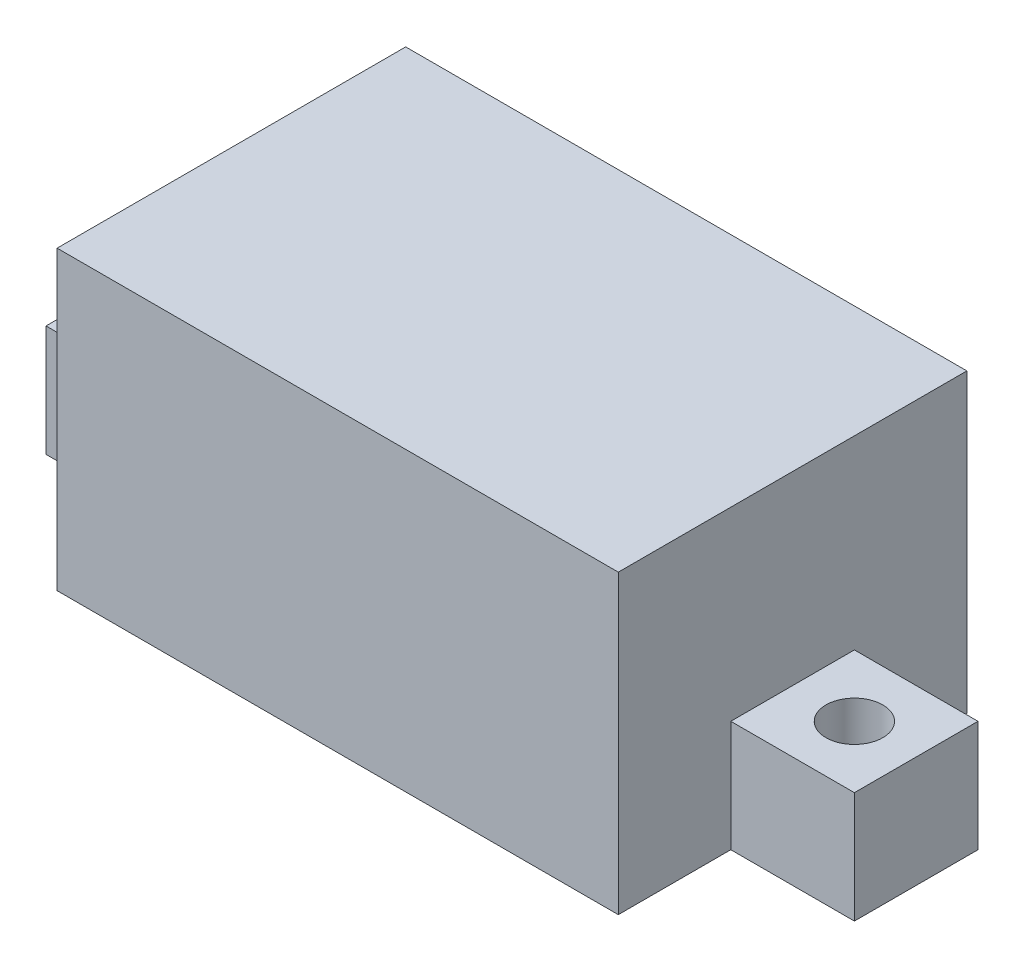
ISO-10303-21;
HEADER;
FILE_DESCRIPTION(('STEP AP214'),'2;1');
FILE_NAME('part.step','',(''),(''),'','','');
FILE_SCHEMA(('AUTOMOTIVE_DESIGN { 1 0 10303 214 1 1 1 1 }'));
ENDSEC;
DATA;
#1=APPLICATION_CONTEXT('core data for automotive mechanical design processes');
#2=APPLICATION_PROTOCOL_DEFINITION('international standard','automotive_design',2000,#1);
#3=PRODUCT_CONTEXT('',#1,'mechanical');
#4=PRODUCT('Part','Part','',(#3));
#5=PRODUCT_RELATED_PRODUCT_CATEGORY('part','',(#4));
#6=PRODUCT_DEFINITION_FORMATION('','',#4);
#7=PRODUCT_DEFINITION_CONTEXT('part definition',#1,'design');
#8=PRODUCT_DEFINITION('design','',#6,#7);
#9=PRODUCT_DEFINITION_SHAPE('','',#8);
#10=(LENGTH_UNIT() NAMED_UNIT(*) SI_UNIT(.MILLI.,.METRE.));
#11=(NAMED_UNIT(*) PLANE_ANGLE_UNIT() SI_UNIT($,.RADIAN.));
#12=(NAMED_UNIT(*) SI_UNIT($,.STERADIAN.) SOLID_ANGLE_UNIT());
#13=UNCERTAINTY_MEASURE_WITH_UNIT(LENGTH_MEASURE(1.E-05),#10,'distance_accuracy_value','');
#14=(GEOMETRIC_REPRESENTATION_CONTEXT(3) GLOBAL_UNCERTAINTY_ASSIGNED_CONTEXT((#13)) GLOBAL_UNIT_ASSIGNED_CONTEXT((#10,
#11,#12)) REPRESENTATION_CONTEXT('',''));
#15=CARTESIAN_POINT('',(0.,0.,0.));
#16=DIRECTION('',(0.,0.,1.));
#17=DIRECTION('',(1.,0.,0.));
#18=AXIS2_PLACEMENT_3D('',#15,#16,#17);
#19=CARTESIAN_POINT('',(22.7,12.,0.));
#20=DIRECTION('',(-1.,0.,0.));
#21=DIRECTION('',(0.,0.,1.));
#22=AXIS2_PLACEMENT_3D('',#19,#20,#21);
#23=PLANE('',#22);
#24=DIRECTION('',(0.,-1.,0.));
#25=VECTOR('',#24,1.);
#26=CARTESIAN_POINT('',(22.7,4.5,-4.55));
#27=LINE('',#26,#25);
#28=CARTESIAN_POINT('',(22.7,4.5,-4.55));
#29=VERTEX_POINT('',#28);
#30=CARTESIAN_POINT('',(22.7,0.,-4.55));
#31=VERTEX_POINT('',#30);
#32=EDGE_CURVE('E146',#29,#31,#27,.T.);
#33=ORIENTED_EDGE('',*,*,#32,.F.);
#34=DIRECTION('',(0.,0.,-1.));
#35=VECTOR('',#34,1.);
#36=CARTESIAN_POINT('',(22.7,4.5,-4.55));
#37=LINE('',#36,#35);
#38=CARTESIAN_POINT('',(22.7,4.5,-9.55));
#39=VERTEX_POINT('',#38);
#40=EDGE_CURVE('E131',#29,#39,#37,.T.);
#41=ORIENTED_EDGE('',*,*,#40,.T.);
#42=DIRECTION('',(0.,-1.,0.));
#43=VECTOR('',#42,1.);
#44=CARTESIAN_POINT('',(22.7,4.5,-9.55));
#45=LINE('',#44,#43);
#46=CARTESIAN_POINT('',(22.7,0.,-9.55));
#47=VERTEX_POINT('',#46);
#48=EDGE_CURVE('E155',#39,#47,#45,.T.);
#49=ORIENTED_EDGE('',*,*,#48,.T.);
#50=DIRECTION('',(0.,0.,-1.));
#51=VECTOR('',#50,1.);
#52=CARTESIAN_POINT('',(22.7,0.,0.));
#53=LINE('',#52,#51);
#54=CARTESIAN_POINT('',(22.7,0.,-14.1));
#55=VERTEX_POINT('',#54);
#56=EDGE_CURVE('E232',#47,#55,#53,.T.);
#57=ORIENTED_EDGE('',*,*,#56,.T.);
#58=DIRECTION('',(0.,-1.,0.));
#59=VECTOR('',#58,1.);
#60=CARTESIAN_POINT('',(22.7,12.,-14.1));
#61=LINE('',#60,#59);
#62=CARTESIAN_POINT('',(22.7,12.,-14.1));
#63=VERTEX_POINT('',#62);
#64=EDGE_CURVE('E49',#63,#55,#61,.T.);
#65=ORIENTED_EDGE('',*,*,#64,.F.);
#66=DIRECTION('',(0.,0.,-1.));
#67=VECTOR('',#66,1.);
#68=CARTESIAN_POINT('',(22.7,12.,0.));
#69=LINE('',#68,#67);
#70=CARTESIAN_POINT('',(22.7,12.,0.));
#71=VERTEX_POINT('',#70);
#72=EDGE_CURVE('E216',#71,#63,#69,.T.);
#73=ORIENTED_EDGE('',*,*,#72,.F.);
#74=DIRECTION('',(0.,-1.,0.));
#75=VECTOR('',#74,1.);
#76=CARTESIAN_POINT('',(22.7,12.,0.));
#77=LINE('',#76,#75);
#78=CARTESIAN_POINT('',(22.7,0.,0.));
#79=VERTEX_POINT('',#78);
#80=EDGE_CURVE('E11',#71,#79,#77,.T.);
#81=ORIENTED_EDGE('',*,*,#80,.T.);
#82=EDGE_CURVE('E153',#79,#31,#53,.T.);
#83=ORIENTED_EDGE('',*,*,#82,.T.);
#84=EDGE_LOOP('',(#33,#41,#49,#57,#65,#73,#81,#83));
#85=FACE_BOUND('',#84,.T.);
#86=ADVANCED_FACE('F40',(#85),#23,.F.);
#87=CARTESIAN_POINT('',(0.,12.,0.));
#88=DIRECTION('',(0.,0.,-1.));
#89=DIRECTION('',(-1.,0.,0.));
#90=AXIS2_PLACEMENT_3D('',#87,#88,#89);
#91=PLANE('',#90);
#92=DIRECTION('',(1.,0.,0.));
#93=VECTOR('',#92,1.);
#94=CARTESIAN_POINT('',(0.,0.,0.));
#95=LINE('',#94,#93);
#96=CARTESIAN_POINT('',(0.,0.,0.));
#97=VERTEX_POINT('',#96);
#98=EDGE_CURVE('E203',#97,#79,#95,.T.);
#99=ORIENTED_EDGE('',*,*,#98,.T.);
#100=ORIENTED_EDGE('',*,*,#80,.F.);
#101=DIRECTION('',(1.,0.,0.));
#102=VECTOR('',#101,1.);
#103=CARTESIAN_POINT('',(0.,12.,0.));
#104=LINE('',#103,#102);
#105=CARTESIAN_POINT('',(0.,12.,0.));
#106=VERTEX_POINT('',#105);
#107=EDGE_CURVE('E212',#106,#71,#104,.T.);
#108=ORIENTED_EDGE('',*,*,#107,.F.);
#109=DIRECTION('',(0.,-1.,0.));
#110=VECTOR('',#109,1.);
#111=CARTESIAN_POINT('',(0.,12.,0.));
#112=LINE('',#111,#110);
#113=EDGE_CURVE('E228',#106,#97,#112,.T.);
#114=ORIENTED_EDGE('',*,*,#113,.T.);
#115=EDGE_LOOP('',(#99,#100,#108,#114));
#116=FACE_BOUND('',#115,.T.);
#117=ADVANCED_FACE('F42',(#116),#91,.F.);
#118=CARTESIAN_POINT('',(0.,12.,-14.1));
#119=DIRECTION('',(0.,0.,-1.));
#120=DIRECTION('',(-1.,0.,0.));
#121=AXIS2_PLACEMENT_3D('',#118,#119,#120);
#122=PLANE('',#121);
#123=DIRECTION('',(1.,0.,0.));
#124=VECTOR('',#123,1.);
#125=CARTESIAN_POINT('',(0.,0.,-14.1));
#126=LINE('',#125,#124);
#127=CARTESIAN_POINT('',(0.,0.,-14.1));
#128=VERTEX_POINT('',#127);
#129=EDGE_CURVE('E235',#128,#55,#126,.T.);
#130=ORIENTED_EDGE('',*,*,#129,.F.);
#131=DIRECTION('',(0.,-1.,0.));
#132=VECTOR('',#131,1.);
#133=CARTESIAN_POINT('',(0.,12.,-14.1));
#134=LINE('',#133,#132);
#135=CARTESIAN_POINT('',(0.,12.,-14.1));
#136=VERTEX_POINT('',#135);
#137=EDGE_CURVE('E245',#136,#128,#134,.T.);
#138=ORIENTED_EDGE('',*,*,#137,.F.);
#139=DIRECTION('',(1.,0.,0.));
#140=VECTOR('',#139,1.);
#141=CARTESIAN_POINT('',(0.,12.,-14.1));
#142=LINE('',#141,#140);
#143=EDGE_CURVE('E220',#136,#63,#142,.T.);
#144=ORIENTED_EDGE('',*,*,#143,.T.);
#145=ORIENTED_EDGE('',*,*,#64,.T.);
#146=EDGE_LOOP('',(#130,#138,#144,#145));
#147=FACE_BOUND('',#146,.T.);
#148=ADVANCED_FACE('F254',(#147),#122,.T.);
#149=CARTESIAN_POINT('',(0.,12.,0.));
#150=DIRECTION('',(-1.,0.,0.));
#151=DIRECTION('',(0.,0.,1.));
#152=AXIS2_PLACEMENT_3D('',#149,#150,#151);
#153=PLANE('',#152);
#154=DIRECTION('',(0.,-1.,0.));
#155=VECTOR('',#154,1.);
#156=CARTESIAN_POINT('',(0.,4.5,-9.55));
#157=LINE('',#156,#155);
#158=CARTESIAN_POINT('',(0.,4.5,-9.55));
#159=VERTEX_POINT('',#158);
#160=CARTESIAN_POINT('',(0.,0.,-9.55));
#161=VERTEX_POINT('',#160);
#162=EDGE_CURVE('E200',#159,#161,#157,.T.);
#163=ORIENTED_EDGE('',*,*,#162,.F.);
#164=DIRECTION('',(0.,0.,1.));
#165=VECTOR('',#164,1.);
#166=CARTESIAN_POINT('',(0.,4.5,-4.55));
#167=LINE('',#166,#165);
#168=CARTESIAN_POINT('',(0.,4.5,-4.55));
#169=VERTEX_POINT('',#168);
#170=EDGE_CURVE('E175',#159,#169,#167,.T.);
#171=ORIENTED_EDGE('',*,*,#170,.T.);
#172=DIRECTION('',(0.,-1.,0.));
#173=VECTOR('',#172,1.);
#174=CARTESIAN_POINT('',(0.,4.5,-4.55));
#175=LINE('',#174,#173);
#176=CARTESIAN_POINT('',(0.,0.,-4.55));
#177=VERTEX_POINT('',#176);
#178=EDGE_CURVE('E191',#169,#177,#175,.T.);
#179=ORIENTED_EDGE('',*,*,#178,.T.);
#180=DIRECTION('',(0.,0.,-1.));
#181=VECTOR('',#180,1.);
#182=CARTESIAN_POINT('',(0.,0.,0.));
#183=LINE('',#182,#181);
#184=EDGE_CURVE('E217',#97,#177,#183,.T.);
#185=ORIENTED_EDGE('',*,*,#184,.F.);
#186=ORIENTED_EDGE('',*,*,#113,.F.);
#187=DIRECTION('',(0.,0.,-1.));
#188=VECTOR('',#187,1.);
#189=CARTESIAN_POINT('',(0.,12.,0.));
#190=LINE('',#189,#188);
#191=EDGE_CURVE('E224',#106,#136,#190,.T.);
#192=ORIENTED_EDGE('',*,*,#191,.T.);
#193=ORIENTED_EDGE('',*,*,#137,.T.);
#194=EDGE_CURVE('E239',#161,#128,#183,.T.);
#195=ORIENTED_EDGE('',*,*,#194,.F.);
#196=EDGE_LOOP('',(#163,#171,#179,#185,#186,#192,#193,#195));
#197=FACE_BOUND('',#196,.T.);
#198=ADVANCED_FACE('F266',(#197),#153,.T.);
#199=CARTESIAN_POINT('',(0.,12.,0.));
#200=DIRECTION('',(0.,1.,0.));
#201=DIRECTION('',(0.,0.,1.));
#202=AXIS2_PLACEMENT_3D('',#199,#200,#201);
#203=PLANE('',#202);
#204=ORIENTED_EDGE('',*,*,#107,.T.);
#205=ORIENTED_EDGE('',*,*,#72,.T.);
#206=ORIENTED_EDGE('',*,*,#143,.F.);
#207=ORIENTED_EDGE('',*,*,#191,.F.);
#208=EDGE_LOOP('',(#204,#205,#206,#207));
#209=FACE_BOUND('',#208,.T.);
#210=ADVANCED_FACE('F269',(#209),#203,.T.);
#211=CARTESIAN_POINT('',(0.,0.,0.));
#212=DIRECTION('',(0.,1.,0.));
#213=DIRECTION('',(0.,0.,1.));
#214=AXIS2_PLACEMENT_3D('',#211,#212,#213);
#215=PLANE('',#214);
#216=ORIENTED_EDGE('',*,*,#98,.F.);
#217=ORIENTED_EDGE('',*,*,#184,.T.);
#218=DIRECTION('',(-1.,0.,0.));
#219=VECTOR('',#218,1.);
#220=CARTESIAN_POINT('',(0.,0.,-4.55));
#221=LINE('',#220,#219);
#222=CARTESIAN_POINT('',(-5.,0.,-4.55));
#223=VERTEX_POINT('',#222);
#224=EDGE_CURVE('E64',#177,#223,#221,.T.);
#225=ORIENTED_EDGE('',*,*,#224,.T.);
#226=DIRECTION('',(0.,0.,-1.));
#227=VECTOR('',#226,1.);
#228=CARTESIAN_POINT('',(-5.,0.,-4.55));
#229=LINE('',#228,#227);
#230=CARTESIAN_POINT('',(-5.,0.,-9.55));
#231=VERTEX_POINT('',#230);
#232=EDGE_CURVE('E194',#223,#231,#229,.T.);
#233=ORIENTED_EDGE('',*,*,#232,.T.);
#234=DIRECTION('',(1.,0.,0.));
#235=VECTOR('',#234,1.);
#236=CARTESIAN_POINT('',(0.,0.,-9.55));
#237=LINE('',#236,#235);
#238=EDGE_CURVE('E180',#231,#161,#237,.T.);
#239=ORIENTED_EDGE('',*,*,#238,.T.);
#240=ORIENTED_EDGE('',*,*,#194,.T.);
#241=ORIENTED_EDGE('',*,*,#129,.T.);
#242=ORIENTED_EDGE('',*,*,#56,.F.);
#243=DIRECTION('',(1.,0.,0.));
#244=VECTOR('',#243,1.);
#245=CARTESIAN_POINT('',(22.7,0.,-9.55));
#246=LINE('',#245,#244);
#247=CARTESIAN_POINT('',(27.7,0.,-9.55));
#248=VERTEX_POINT('',#247);
#249=EDGE_CURVE('E56',#47,#248,#246,.T.);
#250=ORIENTED_EDGE('',*,*,#249,.T.);
#251=DIRECTION('',(0.,0.,1.));
#252=VECTOR('',#251,1.);
#253=CARTESIAN_POINT('',(27.7,0.,-4.55));
#254=LINE('',#253,#252);
#255=CARTESIAN_POINT('',(27.7,0.,-4.55));
#256=VERTEX_POINT('',#255);
#257=EDGE_CURVE('E150',#248,#256,#254,.T.);
#258=ORIENTED_EDGE('',*,*,#257,.T.);
#259=DIRECTION('',(-1.,0.,0.));
#260=VECTOR('',#259,1.);
#261=CARTESIAN_POINT('',(22.7,0.,-4.55));
#262=LINE('',#261,#260);
#263=EDGE_CURVE('E345',#256,#31,#262,.T.);
#264=ORIENTED_EDGE('',*,*,#263,.T.);
#265=ORIENTED_EDGE('',*,*,#82,.F.);
#266=EDGE_LOOP('',(#216,#217,#225,#233,#239,#240,#241,#242,#250,#258,#264,#265));
#267=FACE_BOUND('',#266,.T.);
#268=CARTESIAN_POINT('',(-2.5,0.,-7.05));
#269=DIRECTION('',(0.,-1.,0.));
#270=DIRECTION('',(0.,0.,-1.));
#271=AXIS2_PLACEMENT_3D('',#268,#269,#270);
#272=CIRCLE('',#271,1.15);
#273=CARTESIAN_POINT('',(-2.5,0.,-8.2));
#274=VERTEX_POINT('',#273);
#275=EDGE_CURVE('E171',#274,#274,#272,.T.);
#276=ORIENTED_EDGE('',*,*,#275,.F.);
#277=EDGE_LOOP('',(#276));
#278=FACE_BOUND('',#277,.T.);
#279=CARTESIAN_POINT('',(25.2,0.,-7.05));
#280=DIRECTION('',(0.,-1.,0.));
#281=DIRECTION('',(0.,0.,1.));
#282=AXIS2_PLACEMENT_3D('',#279,#280,#281);
#283=CIRCLE('',#282,1.15);
#284=CARTESIAN_POINT('',(25.2,0.,-5.9));
#285=VERTEX_POINT('',#284);
#286=EDGE_CURVE('E340',#285,#285,#283,.T.);
#287=ORIENTED_EDGE('',*,*,#286,.F.);
#288=EDGE_LOOP('',(#287));
#289=FACE_BOUND('',#288,.T.);
#290=ADVANCED_FACE('F259',(#267,#278,#289),#215,.F.);
#291=CARTESIAN_POINT('',(0.,4.5,-9.55));
#292=DIRECTION('',(0.,0.,-1.));
#293=DIRECTION('',(-1.,0.,0.));
#294=AXIS2_PLACEMENT_3D('',#291,#292,#293);
#295=PLANE('',#294);
#296=ORIENTED_EDGE('',*,*,#238,.F.);
#297=DIRECTION('',(0.,-1.,0.));
#298=VECTOR('',#297,1.);
#299=CARTESIAN_POINT('',(-5.,4.5,-9.55));
#300=LINE('',#299,#298);
#301=CARTESIAN_POINT('',(-5.,4.5,-9.55));
#302=VERTEX_POINT('',#301);
#303=EDGE_CURVE('E204',#302,#231,#300,.T.);
#304=ORIENTED_EDGE('',*,*,#303,.F.);
#305=DIRECTION('',(1.,0.,0.));
#306=VECTOR('',#305,1.);
#307=CARTESIAN_POINT('',(0.,4.5,-9.55));
#308=LINE('',#307,#306);
#309=EDGE_CURVE('E187',#302,#159,#308,.T.);
#310=ORIENTED_EDGE('',*,*,#309,.T.);
#311=ORIENTED_EDGE('',*,*,#162,.T.);
#312=EDGE_LOOP('',(#296,#304,#310,#311));
#313=FACE_BOUND('',#312,.T.);
#314=ADVANCED_FACE('F284',(#313),#295,.T.);
#315=CARTESIAN_POINT('',(-5.,4.5,-4.55));
#316=DIRECTION('',(-1.,0.,0.));
#317=DIRECTION('',(0.,0.,1.));
#318=AXIS2_PLACEMENT_3D('',#315,#316,#317);
#319=PLANE('',#318);
#320=ORIENTED_EDGE('',*,*,#232,.F.);
#321=DIRECTION('',(0.,-1.,0.));
#322=VECTOR('',#321,1.);
#323=CARTESIAN_POINT('',(-5.,4.5,-4.55));
#324=LINE('',#323,#322);
#325=CARTESIAN_POINT('',(-5.,4.5,-4.55));
#326=VERTEX_POINT('',#325);
#327=EDGE_CURVE('E207',#326,#223,#324,.T.);
#328=ORIENTED_EDGE('',*,*,#327,.F.);
#329=DIRECTION('',(0.,0.,-1.));
#330=VECTOR('',#329,1.);
#331=CARTESIAN_POINT('',(-5.,4.5,-4.55));
#332=LINE('',#331,#330);
#333=EDGE_CURVE('E183',#326,#302,#332,.T.);
#334=ORIENTED_EDGE('',*,*,#333,.T.);
#335=ORIENTED_EDGE('',*,*,#303,.T.);
#336=EDGE_LOOP('',(#320,#328,#334,#335));
#337=FACE_BOUND('',#336,.T.);
#338=ADVANCED_FACE('F282',(#337),#319,.T.);
#339=CARTESIAN_POINT('',(0.,4.5,-4.55));
#340=DIRECTION('',(0.,0.,1.));
#341=DIRECTION('',(1.,0.,0.));
#342=AXIS2_PLACEMENT_3D('',#339,#340,#341);
#343=PLANE('',#342);
#344=ORIENTED_EDGE('',*,*,#224,.F.);
#345=ORIENTED_EDGE('',*,*,#178,.F.);
#346=DIRECTION('',(-1.,0.,0.));
#347=VECTOR('',#346,1.);
#348=CARTESIAN_POINT('',(0.,4.5,-4.55));
#349=LINE('',#348,#347);
#350=EDGE_CURVE('E179',#169,#326,#349,.T.);
#351=ORIENTED_EDGE('',*,*,#350,.T.);
#352=ORIENTED_EDGE('',*,*,#327,.T.);
#353=EDGE_LOOP('',(#344,#345,#351,#352));
#354=FACE_BOUND('',#353,.T.);
#355=ADVANCED_FACE('F275',(#354),#343,.T.);
#356=CARTESIAN_POINT('',(0.,4.5,0.));
#357=DIRECTION('',(0.,1.,0.));
#358=DIRECTION('',(0.,0.,1.));
#359=AXIS2_PLACEMENT_3D('',#356,#357,#358);
#360=PLANE('',#359);
#361=CARTESIAN_POINT('',(-2.5,4.5,-7.05));
#362=DIRECTION('',(0.,-1.,0.));
#363=DIRECTION('',(0.,0.,-1.));
#364=AXIS2_PLACEMENT_3D('',#361,#362,#363);
#365=CIRCLE('',#364,1.15);
#366=CARTESIAN_POINT('',(-2.5,4.5,-8.2));
#367=VERTEX_POINT('',#366);
#368=EDGE_CURVE('E167',#367,#367,#365,.T.);
#369=ORIENTED_EDGE('',*,*,#368,.T.);
#370=EDGE_LOOP('',(#369));
#371=FACE_BOUND('',#370,.T.);
#372=ORIENTED_EDGE('',*,*,#170,.F.);
#373=ORIENTED_EDGE('',*,*,#309,.F.);
#374=ORIENTED_EDGE('',*,*,#333,.F.);
#375=ORIENTED_EDGE('',*,*,#350,.F.);
#376=EDGE_LOOP('',(#372,#373,#374,#375));
#377=FACE_BOUND('',#376,.T.);
#378=ADVANCED_FACE('F278',(#371,#377),#360,.T.);
#379=CARTESIAN_POINT('',(-2.5,4.5,-7.05));
#380=DIRECTION('',(0.,-1.,0.));
#381=DIRECTION('',(0.,0.,-1.));
#382=AXIS2_PLACEMENT_3D('',#379,#380,#381);
#383=CYLINDRICAL_SURFACE('',#382,1.15);
#384=ORIENTED_EDGE('',*,*,#368,.F.);
#385=EDGE_LOOP('',(#384));
#386=FACE_BOUND('',#385,.T.);
#387=ORIENTED_EDGE('',*,*,#275,.T.);
#388=EDGE_LOOP('',(#387));
#389=FACE_BOUND('',#388,.T.);
#390=ADVANCED_FACE('F309',(#386,#389),#383,.F.);
#391=CARTESIAN_POINT('',(22.7,4.5,-4.55));
#392=DIRECTION('',(0.,0.,1.));
#393=DIRECTION('',(1.,0.,0.));
#394=AXIS2_PLACEMENT_3D('',#391,#392,#393);
#395=PLANE('',#394);
#396=ORIENTED_EDGE('',*,*,#263,.F.);
#397=DIRECTION('',(0.,-1.,0.));
#398=VECTOR('',#397,1.);
#399=CARTESIAN_POINT('',(27.7,4.5,-4.55));
#400=LINE('',#399,#398);
#401=CARTESIAN_POINT('',(27.7,4.5,-4.55));
#402=VERTEX_POINT('',#401);
#403=EDGE_CURVE('E148',#402,#256,#400,.T.);
#404=ORIENTED_EDGE('',*,*,#403,.F.);
#405=DIRECTION('',(-1.,0.,0.));
#406=VECTOR('',#405,1.);
#407=CARTESIAN_POINT('',(22.7,4.5,-4.55));
#408=LINE('',#407,#406);
#409=EDGE_CURVE('E135',#402,#29,#408,.T.);
#410=ORIENTED_EDGE('',*,*,#409,.T.);
#411=ORIENTED_EDGE('',*,*,#32,.T.);
#412=EDGE_LOOP('',(#396,#404,#410,#411));
#413=FACE_BOUND('',#412,.T.);
#414=ADVANCED_FACE('F145',(#413),#395,.T.);
#415=CARTESIAN_POINT('',(27.7,4.5,-4.55));
#416=DIRECTION('',(1.,0.,0.));
#417=DIRECTION('',(0.,0.,-1.));
#418=AXIS2_PLACEMENT_3D('',#415,#416,#417);
#419=PLANE('',#418);
#420=ORIENTED_EDGE('',*,*,#257,.F.);
#421=DIRECTION('',(0.,-1.,0.));
#422=VECTOR('',#421,1.);
#423=CARTESIAN_POINT('',(27.7,4.5,-9.55));
#424=LINE('',#423,#422);
#425=CARTESIAN_POINT('',(27.7,4.5,-9.55));
#426=VERTEX_POINT('',#425);
#427=EDGE_CURVE('E161',#426,#248,#424,.T.);
#428=ORIENTED_EDGE('',*,*,#427,.F.);
#429=DIRECTION('',(0.,0.,1.));
#430=VECTOR('',#429,1.);
#431=CARTESIAN_POINT('',(27.7,4.5,-4.55));
#432=LINE('',#431,#430);
#433=EDGE_CURVE('E156',#426,#402,#432,.T.);
#434=ORIENTED_EDGE('',*,*,#433,.T.);
#435=ORIENTED_EDGE('',*,*,#403,.T.);
#436=EDGE_LOOP('',(#420,#428,#434,#435));
#437=FACE_BOUND('',#436,.T.);
#438=ADVANCED_FACE('F319',(#437),#419,.T.);
#439=CARTESIAN_POINT('',(22.7,4.5,-9.55));
#440=DIRECTION('',(0.,0.,-1.));
#441=DIRECTION('',(-1.,0.,0.));
#442=AXIS2_PLACEMENT_3D('',#439,#440,#441);
#443=PLANE('',#442);
#444=ORIENTED_EDGE('',*,*,#249,.F.);
#445=ORIENTED_EDGE('',*,*,#48,.F.);
#446=DIRECTION('',(1.,0.,0.));
#447=VECTOR('',#446,1.);
#448=CARTESIAN_POINT('',(22.7,4.5,-9.55));
#449=LINE('',#448,#447);
#450=EDGE_CURVE('E138',#39,#426,#449,.T.);
#451=ORIENTED_EDGE('',*,*,#450,.T.);
#452=ORIENTED_EDGE('',*,*,#427,.T.);
#453=EDGE_LOOP('',(#444,#445,#451,#452));
#454=FACE_BOUND('',#453,.T.);
#455=ADVANCED_FACE('F320',(#454),#443,.T.);
#456=CARTESIAN_POINT('',(0.,4.5,0.));
#457=DIRECTION('',(0.,1.,0.));
#458=DIRECTION('',(0.,0.,1.));
#459=AXIS2_PLACEMENT_3D('',#456,#457,#458);
#460=PLANE('',#459);
#461=CARTESIAN_POINT('',(25.2,4.5,-7.05));
#462=DIRECTION('',(0.,-1.,0.));
#463=DIRECTION('',(0.,0.,1.));
#464=AXIS2_PLACEMENT_3D('',#461,#462,#463);
#465=CIRCLE('',#464,1.15);
#466=CARTESIAN_POINT('',(25.2,4.5,-5.9));
#467=VERTEX_POINT('',#466);
#468=EDGE_CURVE('E337',#467,#467,#465,.T.);
#469=ORIENTED_EDGE('',*,*,#468,.T.);
#470=EDGE_LOOP('',(#469));
#471=FACE_BOUND('',#470,.T.);
#472=ORIENTED_EDGE('',*,*,#409,.F.);
#473=ORIENTED_EDGE('',*,*,#433,.F.);
#474=ORIENTED_EDGE('',*,*,#450,.F.);
#475=ORIENTED_EDGE('',*,*,#40,.F.);
#476=EDGE_LOOP('',(#472,#473,#474,#475));
#477=FACE_BOUND('',#476,.T.);
#478=ADVANCED_FACE('F133',(#471,#477),#460,.T.);
#479=CARTESIAN_POINT('',(25.2,4.5,-7.05));
#480=DIRECTION('',(0.,-1.,0.));
#481=DIRECTION('',(0.,0.,-1.));
#482=AXIS2_PLACEMENT_3D('',#479,#480,#481);
#483=CYLINDRICAL_SURFACE('',#482,1.15);
#484=ORIENTED_EDGE('',*,*,#468,.F.);
#485=EDGE_LOOP('',(#484));
#486=FACE_BOUND('',#485,.T.);
#487=ORIENTED_EDGE('',*,*,#286,.T.);
#488=EDGE_LOOP('',(#487));
#489=FACE_BOUND('',#488,.T.);
#490=ADVANCED_FACE('F328',(#486,#489),#483,.F.);
#491=CLOSED_SHELL('',(#86,#117,#148,#198,#210,#290,#314,#338,#355,#378,#390,#414,#438,#455,#478,#490));
#492=MANIFOLD_SOLID_BREP('B2',#491);
#493=ADVANCED_BREP_SHAPE_REPRESENTATION('',(#18,#492),#14);
#494=SHAPE_DEFINITION_REPRESENTATION(#9,#493);
ENDSEC;
END-ISO-10303-21;
